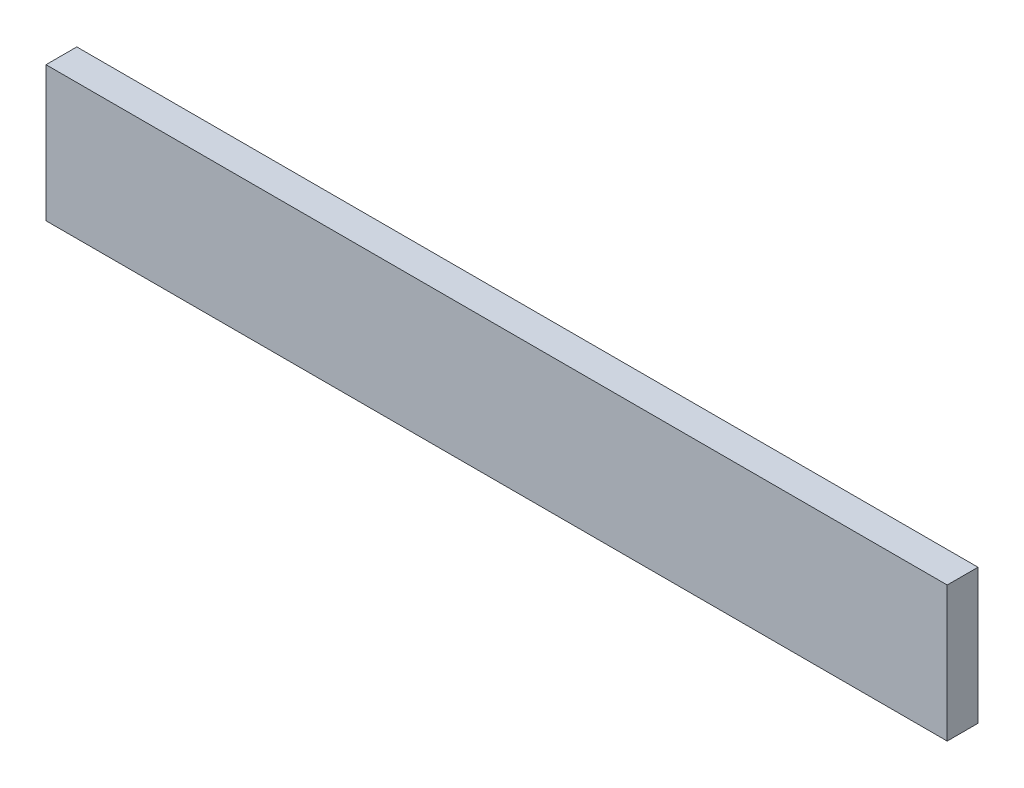
ISO-10303-21;
HEADER;
FILE_DESCRIPTION(('STEP AP214'),'2;1');
FILE_NAME('part.step','',(''),(''),'','','');
FILE_SCHEMA(('AUTOMOTIVE_DESIGN { 1 0 10303 214 1 1 1 1 }'));
ENDSEC;
DATA;
#1=APPLICATION_CONTEXT('core data for automotive mechanical design processes');
#2=APPLICATION_PROTOCOL_DEFINITION('international standard','automotive_design',2000,#1);
#3=PRODUCT_CONTEXT('',#1,'mechanical');
#4=PRODUCT('Part','Part','',(#3));
#5=PRODUCT_RELATED_PRODUCT_CATEGORY('part','',(#4));
#6=PRODUCT_DEFINITION_FORMATION('','',#4);
#7=PRODUCT_DEFINITION_CONTEXT('part definition',#1,'design');
#8=PRODUCT_DEFINITION('design','',#6,#7);
#9=PRODUCT_DEFINITION_SHAPE('','',#8);
#10=(LENGTH_UNIT() NAMED_UNIT(*) SI_UNIT(.MILLI.,.METRE.));
#11=(NAMED_UNIT(*) PLANE_ANGLE_UNIT() SI_UNIT($,.RADIAN.));
#12=(NAMED_UNIT(*) SI_UNIT($,.STERADIAN.) SOLID_ANGLE_UNIT());
#13=UNCERTAINTY_MEASURE_WITH_UNIT(LENGTH_MEASURE(1.E-05),#10,'distance_accuracy_value','');
#14=(GEOMETRIC_REPRESENTATION_CONTEXT(3) GLOBAL_UNCERTAINTY_ASSIGNED_CONTEXT((#13)) GLOBAL_UNIT_ASSIGNED_CONTEXT((#10,
#11,#12)) REPRESENTATION_CONTEXT('',''));
#15=CARTESIAN_POINT('',(0.,0.,0.));
#16=DIRECTION('',(0.,0.,1.));
#17=DIRECTION('',(1.,0.,0.));
#18=AXIS2_PLACEMENT_3D('',#15,#16,#17);
#19=CARTESIAN_POINT('',(-300.,90.0000000000001,20.5));
#20=DIRECTION('',(1.,0.,0.));
#21=DIRECTION('',(0.,1.,0.));
#22=AXIS2_PLACEMENT_3D('',#19,#20,#21);
#23=PLANE('',#22);
#24=DIRECTION('',(0.,-1.,0.));
#25=VECTOR('',#24,1.);
#26=CARTESIAN_POINT('',(-300.,90.0000000000001,0.));
#27=LINE('',#26,#25);
#28=CARTESIAN_POINT('',(-300.,90.0000000000001,0.));
#29=VERTEX_POINT('',#28);
#30=CARTESIAN_POINT('',(-300.,0.,0.));
#31=VERTEX_POINT('',#30);
#32=EDGE_CURVE('E96',#29,#31,#27,.T.);
#33=ORIENTED_EDGE('',*,*,#32,.T.);
#34=DIRECTION('',(0.,0.,-1.));
#35=VECTOR('',#34,1.);
#36=CARTESIAN_POINT('',(-300.,0.,20.5));
#37=LINE('',#36,#35);
#38=CARTESIAN_POINT('',(-300.,0.,20.5));
#39=VERTEX_POINT('',#38);
#40=EDGE_CURVE('E11',#39,#31,#37,.T.);
#41=ORIENTED_EDGE('',*,*,#40,.F.);
#42=DIRECTION('',(0.,-1.,0.));
#43=VECTOR('',#42,1.);
#44=CARTESIAN_POINT('',(-300.,90.0000000000001,20.5));
#45=LINE('',#44,#43);
#46=CARTESIAN_POINT('',(-300.,90.0000000000001,20.5));
#47=VERTEX_POINT('',#46);
#48=EDGE_CURVE('E84',#47,#39,#45,.T.);
#49=ORIENTED_EDGE('',*,*,#48,.F.);
#50=DIRECTION('',(0.,0.,-1.));
#51=VECTOR('',#50,1.);
#52=CARTESIAN_POINT('',(-300.,90.0000000000001,20.5));
#53=LINE('',#52,#51);
#54=EDGE_CURVE('E92',#47,#29,#53,.T.);
#55=ORIENTED_EDGE('',*,*,#54,.T.);
#56=EDGE_LOOP('',(#33,#41,#49,#55));
#57=FACE_BOUND('',#56,.T.);
#58=ADVANCED_FACE('F33',(#57),#23,.F.);
#59=CARTESIAN_POINT('',(-300.,0.,20.5));
#60=DIRECTION('',(0.,1.,0.));
#61=DIRECTION('',(0.,0.,1.));
#62=AXIS2_PLACEMENT_3D('',#59,#60,#61);
#63=PLANE('',#62);
#64=DIRECTION('',(1.,0.,0.));
#65=VECTOR('',#64,1.);
#66=CARTESIAN_POINT('',(-300.,0.,0.));
#67=LINE('',#66,#65);
#68=CARTESIAN_POINT('',(300.,0.,0.));
#69=VERTEX_POINT('',#68);
#70=EDGE_CURVE('E88',#31,#69,#67,.T.);
#71=ORIENTED_EDGE('',*,*,#70,.T.);
#72=DIRECTION('',(0.,0.,-1.));
#73=VECTOR('',#72,1.);
#74=CARTESIAN_POINT('',(300.,0.,20.5));
#75=LINE('',#74,#73);
#76=CARTESIAN_POINT('',(300.,0.,20.5));
#77=VERTEX_POINT('',#76);
#78=EDGE_CURVE('E41',#77,#69,#75,.T.);
#79=ORIENTED_EDGE('',*,*,#78,.F.);
#80=DIRECTION('',(1.,0.,0.));
#81=VECTOR('',#80,1.);
#82=CARTESIAN_POINT('',(-300.,0.,20.5));
#83=LINE('',#82,#81);
#84=EDGE_CURVE('E79',#39,#77,#83,.T.);
#85=ORIENTED_EDGE('',*,*,#84,.F.);
#86=ORIENTED_EDGE('',*,*,#40,.T.);
#87=EDGE_LOOP('',(#71,#79,#85,#86));
#88=FACE_BOUND('',#87,.T.);
#89=ADVANCED_FACE('F87',(#88),#63,.F.);
#90=CARTESIAN_POINT('',(300.,90.0000000000001,20.5));
#91=DIRECTION('',(-1.,0.,0.));
#92=DIRECTION('',(0.,-1.,0.));
#93=AXIS2_PLACEMENT_3D('',#90,#91,#92);
#94=PLANE('',#93);
#95=DIRECTION('',(0.,1.,0.));
#96=VECTOR('',#95,1.);
#97=CARTESIAN_POINT('',(300.,90.0000000000001,0.));
#98=LINE('',#97,#96);
#99=CARTESIAN_POINT('',(300.,90.0000000000001,0.));
#100=VERTEX_POINT('',#99);
#101=EDGE_CURVE('E66',#69,#100,#98,.T.);
#102=ORIENTED_EDGE('',*,*,#101,.T.);
#103=DIRECTION('',(0.,0.,-1.));
#104=VECTOR('',#103,1.);
#105=CARTESIAN_POINT('',(300.,90.0000000000001,20.5));
#106=LINE('',#105,#104);
#107=CARTESIAN_POINT('',(300.,90.0000000000001,20.5));
#108=VERTEX_POINT('',#107);
#109=EDGE_CURVE('E89',#108,#100,#106,.T.);
#110=ORIENTED_EDGE('',*,*,#109,.F.);
#111=DIRECTION('',(0.,1.,0.));
#112=VECTOR('',#111,1.);
#113=CARTESIAN_POINT('',(300.,90.0000000000001,20.5));
#114=LINE('',#113,#112);
#115=EDGE_CURVE('E82',#77,#108,#114,.T.);
#116=ORIENTED_EDGE('',*,*,#115,.F.);
#117=ORIENTED_EDGE('',*,*,#78,.T.);
#118=EDGE_LOOP('',(#102,#110,#116,#117));
#119=FACE_BOUND('',#118,.T.);
#120=ADVANCED_FACE('F90',(#119),#94,.F.);
#121=CARTESIAN_POINT('',(-300.,90.0000000000001,20.5));
#122=DIRECTION('',(0.,-1.,0.));
#123=DIRECTION('',(1.,0.,0.));
#124=AXIS2_PLACEMENT_3D('',#121,#122,#123);
#125=PLANE('',#124);
#126=DIRECTION('',(-1.,0.,0.));
#127=VECTOR('',#126,1.);
#128=CARTESIAN_POINT('',(-300.,90.0000000000001,0.));
#129=LINE('',#128,#127);
#130=EDGE_CURVE('E72',#100,#29,#129,.T.);
#131=ORIENTED_EDGE('',*,*,#130,.T.);
#132=ORIENTED_EDGE('',*,*,#54,.F.);
#133=DIRECTION('',(-1.,0.,0.));
#134=VECTOR('',#133,1.);
#135=CARTESIAN_POINT('',(-300.,90.0000000000001,20.5));
#136=LINE('',#135,#134);
#137=EDGE_CURVE('E49',#108,#47,#136,.T.);
#138=ORIENTED_EDGE('',*,*,#137,.F.);
#139=ORIENTED_EDGE('',*,*,#109,.T.);
#140=EDGE_LOOP('',(#131,#132,#138,#139));
#141=FACE_BOUND('',#140,.T.);
#142=ADVANCED_FACE('F103',(#141),#125,.F.);
#143=CARTESIAN_POINT('',(0.,0.,20.5));
#144=DIRECTION('',(0.,0.,1.));
#145=DIRECTION('',(1.,0.,0.));
#146=AXIS2_PLACEMENT_3D('',#143,#144,#145);
#147=PLANE('',#146);
#148=ORIENTED_EDGE('',*,*,#48,.T.);
#149=ORIENTED_EDGE('',*,*,#84,.T.);
#150=ORIENTED_EDGE('',*,*,#115,.T.);
#151=ORIENTED_EDGE('',*,*,#137,.T.);
#152=EDGE_LOOP('',(#148,#149,#150,#151));
#153=FACE_BOUND('',#152,.T.);
#154=ADVANCED_FACE('F80',(#153),#147,.T.);
#155=CARTESIAN_POINT('',(0.,0.,0.));
#156=DIRECTION('',(0.,0.,1.));
#157=DIRECTION('',(1.,0.,0.));
#158=AXIS2_PLACEMENT_3D('',#155,#156,#157);
#159=PLANE('',#158);
#160=ORIENTED_EDGE('',*,*,#32,.F.);
#161=ORIENTED_EDGE('',*,*,#130,.F.);
#162=ORIENTED_EDGE('',*,*,#101,.F.);
#163=ORIENTED_EDGE('',*,*,#70,.F.);
#164=EDGE_LOOP('',(#160,#161,#162,#163));
#165=FACE_BOUND('',#164,.T.);
#166=ADVANCED_FACE('F106',(#165),#159,.F.);
#167=CLOSED_SHELL('',(#58,#89,#120,#142,#154,#166));
#168=MANIFOLD_SOLID_BREP('B2',#167);
#169=ADVANCED_BREP_SHAPE_REPRESENTATION('',(#18,#168),#14);
#170=SHAPE_DEFINITION_REPRESENTATION(#9,#169);
ENDSEC;
END-ISO-10303-21;
